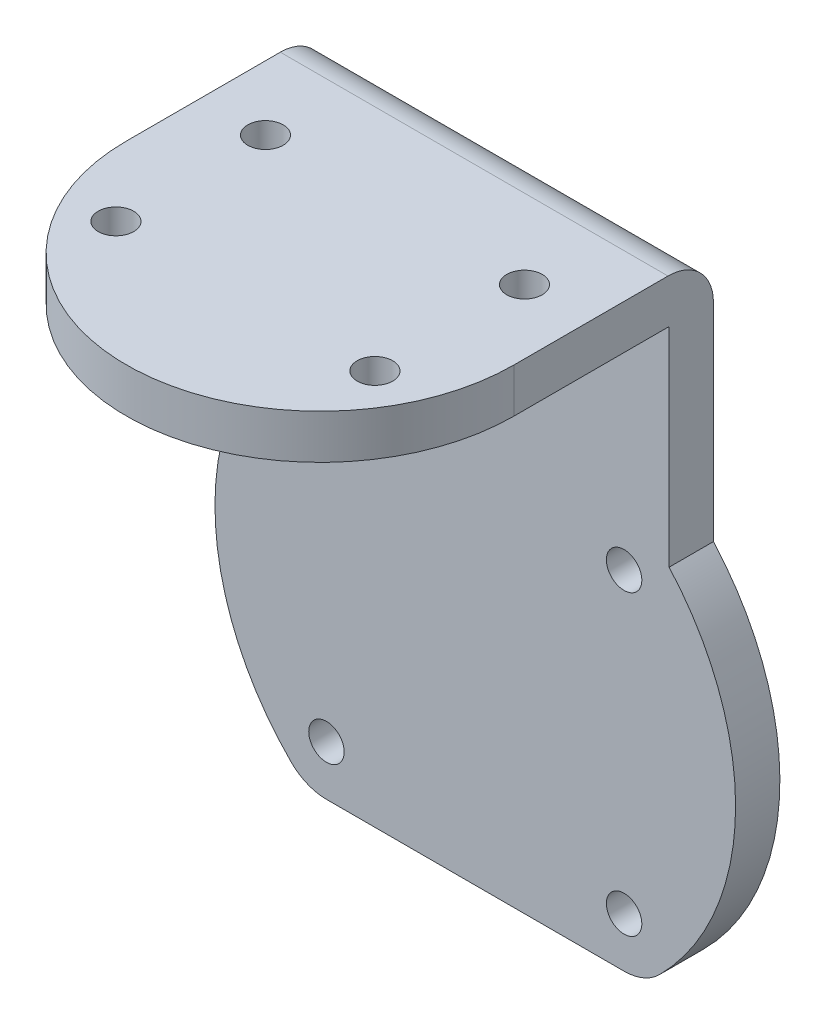
ISO-10303-21;
HEADER;
FILE_DESCRIPTION(('STEP AP214'),'2;1');
FILE_NAME('part.step','',(''),(''),'','','');
FILE_SCHEMA(('AUTOMOTIVE_DESIGN { 1 0 10303 214 1 1 1 1 }'));
ENDSEC;
DATA;
#1=APPLICATION_CONTEXT('core data for automotive mechanical design processes');
#2=APPLICATION_PROTOCOL_DEFINITION('international standard','automotive_design',2000,#1);
#3=PRODUCT_CONTEXT('',#1,'mechanical');
#4=PRODUCT('Part','Part','',(#3));
#5=PRODUCT_RELATED_PRODUCT_CATEGORY('part','',(#4));
#6=PRODUCT_DEFINITION_FORMATION('','',#4);
#7=PRODUCT_DEFINITION_CONTEXT('part definition',#1,'design');
#8=PRODUCT_DEFINITION('design','',#6,#7);
#9=PRODUCT_DEFINITION_SHAPE('','',#8);
#10=(LENGTH_UNIT() NAMED_UNIT(*) SI_UNIT(.MILLI.,.METRE.));
#11=(NAMED_UNIT(*) PLANE_ANGLE_UNIT() SI_UNIT($,.RADIAN.));
#12=(NAMED_UNIT(*) SI_UNIT($,.STERADIAN.) SOLID_ANGLE_UNIT());
#13=UNCERTAINTY_MEASURE_WITH_UNIT(LENGTH_MEASURE(1.E-05),#10,'distance_accuracy_value','');
#14=(GEOMETRIC_REPRESENTATION_CONTEXT(3) GLOBAL_UNCERTAINTY_ASSIGNED_CONTEXT((#13)) GLOBAL_UNIT_ASSIGNED_CONTEXT((#10,
#11,#12)) REPRESENTATION_CONTEXT('',''));
#15=CARTESIAN_POINT('',(0.,0.,0.));
#16=DIRECTION('',(0.,0.,1.));
#17=DIRECTION('',(1.,0.,0.));
#18=AXIS2_PLACEMENT_3D('',#15,#16,#17);
#19=CARTESIAN_POINT('',(0.,38.4999999999963,-21.5000000000017));
#20=DIRECTION('',(0.,1.,3.28625990152976E-13));
#21=DIRECTION('',(0.,3.28625990152976E-13,-1.));
#22=AXIS2_PLACEMENT_3D('',#19,#20,#21);
#23=PLANE('',#22);
#24=CARTESIAN_POINT('',(11.6913429510899,38.4999999999963,-0.749999999999176));
#25=DIRECTION('',(0.,-1.,0.));
#26=DIRECTION('',(0.,0.,1.));
#27=AXIS2_PLACEMENT_3D('',#24,#25,#26);
#28=CIRCLE('',#27,1.6);
#29=CARTESIAN_POINT('',(11.6913429510899,38.4999999999963,0.850000000000824));
#30=VERTEX_POINT('',#29);
#31=EDGE_CURVE('E179',#30,#30,#28,.T.);
#32=ORIENTED_EDGE('',*,*,#31,.T.);
#33=EDGE_LOOP('',(#32));
#34=FACE_BOUND('',#33,.T.);
#35=CARTESIAN_POINT('',(-11.6913429510899,38.4999999999963,-14.2499999999992));
#36=DIRECTION('',(0.,-1.,0.));
#37=DIRECTION('',(0.,0.,1.));
#38=AXIS2_PLACEMENT_3D('',#35,#36,#37);
#39=CIRCLE('',#38,1.6);
#40=CARTESIAN_POINT('',(-11.6913429510899,38.4999999999963,-12.6499999999992));
#41=VERTEX_POINT('',#40);
#42=EDGE_CURVE('E274',#41,#41,#39,.T.);
#43=ORIENTED_EDGE('',*,*,#42,.T.);
#44=EDGE_LOOP('',(#43));
#45=FACE_BOUND('',#44,.T.);
#46=CARTESIAN_POINT('',(-11.6913429510899,38.4999999999963,-0.749999999999184));
#47=DIRECTION('',(0.,-1.,0.));
#48=DIRECTION('',(0.,0.,1.));
#49=AXIS2_PLACEMENT_3D('',#46,#47,#48);
#50=CIRCLE('',#49,1.6);
#51=CARTESIAN_POINT('',(-11.6913429510899,38.4999999999963,0.850000000000816));
#52=VERTEX_POINT('',#51);
#53=EDGE_CURVE('E200',#52,#52,#50,.T.);
#54=ORIENTED_EDGE('',*,*,#53,.T.);
#55=EDGE_LOOP('',(#54));
#56=FACE_BOUND('',#55,.T.);
#57=CARTESIAN_POINT('',(11.6913429510899,38.4999999999963,-14.2499999999992));
#58=DIRECTION('',(0.,-1.,0.));
#59=DIRECTION('',(0.,0.,1.));
#60=AXIS2_PLACEMENT_3D('',#57,#58,#59);
#61=CIRCLE('',#60,1.6);
#62=CARTESIAN_POINT('',(11.6913429510899,38.4999999999963,-12.6499999999992));
#63=VERTEX_POINT('',#62);
#64=EDGE_CURVE('E201',#63,#63,#61,.T.);
#65=ORIENTED_EDGE('',*,*,#64,.T.);
#66=EDGE_LOOP('',(#65));
#67=FACE_BOUND('',#66,.T.);
#68=DIRECTION('',(0.,3.28625990152976E-13,-1.));
#69=VECTOR('',#68,1.);
#70=CARTESIAN_POINT('',(17.5,38.499999999994,-14.5000000000005));
#71=LINE('',#70,#69);
#72=CARTESIAN_POINT('',(17.5,38.4999999999893,-7.49999999999918));
#73=VERTEX_POINT('',#72);
#74=CARTESIAN_POINT('',(17.5,38.4999999999893,-21.400000000003));
#75=VERTEX_POINT('',#74);
#76=EDGE_CURVE('E229',#73,#75,#71,.T.);
#77=ORIENTED_EDGE('',*,*,#76,.T.);
#78=DIRECTION('',(1.,0.,0.));
#79=VECTOR('',#78,1.);
#80=CARTESIAN_POINT('',(0.,38.4999999999963,-21.4000000000017));
#81=LINE('',#80,#79);
#82=CARTESIAN_POINT('',(-17.5,38.4999999999893,-21.400000000003));
#83=VERTEX_POINT('',#82);
#84=EDGE_CURVE('E27',#83,#75,#81,.T.);
#85=ORIENTED_EDGE('',*,*,#84,.F.);
#86=DIRECTION('',(0.,-3.28625990152976E-13,1.));
#87=VECTOR('',#86,1.);
#88=CARTESIAN_POINT('',(-17.5,38.499999999997,-23.5000000000022));
#89=LINE('',#88,#87);
#90=CARTESIAN_POINT('',(-17.5,38.4999999999893,-7.49999999999918));
#91=VERTEX_POINT('',#90);
#92=EDGE_CURVE('E21',#83,#91,#89,.T.);
#93=ORIENTED_EDGE('',*,*,#92,.T.);
#94=CARTESIAN_POINT('',(0.,38.4999999999963,-7.49999999999918));
#95=DIRECTION('',(0.,1.,3.28625990152976E-13));
#96=DIRECTION('',(-1.,0.,0.));
#97=AXIS2_PLACEMENT_3D('',#94,#95,#96);
#98=CIRCLE('',#97,17.5);
#99=EDGE_CURVE('E249',#91,#73,#98,.T.);
#100=ORIENTED_EDGE('',*,*,#99,.T.);
#101=EDGE_LOOP('',(#77,#85,#93,#100));
#102=FACE_BOUND('',#101,.T.);
#103=ADVANCED_FACE('F17',(#34,#45,#56,#67,#102),#23,.T.);
#104=CARTESIAN_POINT('',(0.,34.3999999999963,-21.400000000003));
#105=DIRECTION('',(1.,0.,0.));
#106=DIRECTION('',(0.,0.707106781186673,-0.707106781186422));
#107=AXIS2_PLACEMENT_3D('',#104,#105,#106);
#108=CYLINDRICAL_SURFACE('',#107,0.1);
#109=CARTESIAN_POINT('',(17.5,34.3999999999963,-21.400000000003));
#110=DIRECTION('',(1.,0.,0.));
#111=DIRECTION('',(0.,0.707106781186673,-0.707106781186422));
#112=AXIS2_PLACEMENT_3D('',#109,#110,#111);
#113=CIRCLE('',#112,0.1);
#114=CARTESIAN_POINT('',(17.5,34.3999999999963,-21.500000000003));
#115=VERTEX_POINT('',#114);
#116=CARTESIAN_POINT('',(17.5,34.4999999999963,-21.400000000003));
#117=VERTEX_POINT('',#116);
#118=EDGE_CURVE('E296',#115,#117,#113,.T.);
#119=ORIENTED_EDGE('',*,*,#118,.T.);
#120=DIRECTION('',(1.,0.,0.));
#121=VECTOR('',#120,1.);
#122=CARTESIAN_POINT('',(0.,34.4999999999963,-21.400000000003));
#123=LINE('',#122,#121);
#124=CARTESIAN_POINT('',(-17.5,34.4999999999963,-21.400000000003));
#125=VERTEX_POINT('',#124);
#126=EDGE_CURVE('E11',#125,#117,#123,.T.);
#127=ORIENTED_EDGE('',*,*,#126,.F.);
#128=CARTESIAN_POINT('',(-17.5,34.3999999999963,-21.400000000003));
#129=DIRECTION('',(-1.,0.,0.));
#130=DIRECTION('',(0.,0.707106781186673,-0.707106781186422));
#131=AXIS2_PLACEMENT_3D('',#128,#129,#130);
#132=CIRCLE('',#131,0.1);
#133=CARTESIAN_POINT('',(-17.5,34.3999999999963,-21.500000000003));
#134=VERTEX_POINT('',#133);
#135=EDGE_CURVE('E327',#125,#134,#132,.T.);
#136=ORIENTED_EDGE('',*,*,#135,.T.);
#137=DIRECTION('',(-1.,0.,0.));
#138=VECTOR('',#137,1.);
#139=CARTESIAN_POINT('',(0.,34.3999999999963,-21.500000000003));
#140=LINE('',#139,#138);
#141=EDGE_CURVE('E184',#115,#134,#140,.T.);
#142=ORIENTED_EDGE('',*,*,#141,.F.);
#143=EDGE_LOOP('',(#119,#127,#136,#142));
#144=FACE_BOUND('',#143,.T.);
#145=ADVANCED_FACE('F19',(#144),#108,.F.);
#146=CARTESIAN_POINT('',(0.,34.4999999999963,-21.5000000000031));
#147=DIRECTION('',(0.,1.,3.28625990152976E-13));
#148=DIRECTION('',(0.,3.28625990152976E-13,-1.));
#149=AXIS2_PLACEMENT_3D('',#146,#147,#148);
#150=PLANE('',#149);
#151=CARTESIAN_POINT('',(11.6913429510899,34.4999999999963,-0.749999999999177));
#152=DIRECTION('',(0.,1.,0.));
#153=DIRECTION('',(0.,0.,1.));
#154=AXIS2_PLACEMENT_3D('',#151,#152,#153);
#155=CIRCLE('',#154,1.6);
#156=CARTESIAN_POINT('',(11.6913429510899,34.4999999999963,0.850000000000823));
#157=VERTEX_POINT('',#156);
#158=EDGE_CURVE('E174',#157,#157,#155,.T.);
#159=ORIENTED_EDGE('',*,*,#158,.T.);
#160=EDGE_LOOP('',(#159));
#161=FACE_BOUND('',#160,.T.);
#162=CARTESIAN_POINT('',(-11.6913429510899,34.4999999999963,-14.2499999999992));
#163=DIRECTION('',(0.,1.,0.));
#164=DIRECTION('',(0.,0.,1.));
#165=AXIS2_PLACEMENT_3D('',#162,#163,#164);
#166=CIRCLE('',#165,1.6);
#167=CARTESIAN_POINT('',(-11.6913429510899,34.4999999999963,-12.6499999999992));
#168=VERTEX_POINT('',#167);
#169=EDGE_CURVE('E306',#168,#168,#166,.T.);
#170=ORIENTED_EDGE('',*,*,#169,.T.);
#171=EDGE_LOOP('',(#170));
#172=FACE_BOUND('',#171,.T.);
#173=CARTESIAN_POINT('',(-11.6913429510899,34.4999999999963,-0.749999999999185));
#174=DIRECTION('',(0.,1.,0.));
#175=DIRECTION('',(0.,0.,1.));
#176=AXIS2_PLACEMENT_3D('',#173,#174,#175);
#177=CIRCLE('',#176,1.6);
#178=CARTESIAN_POINT('',(-11.6913429510899,34.4999999999963,0.850000000000815));
#179=VERTEX_POINT('',#178);
#180=EDGE_CURVE('E270',#179,#179,#177,.T.);
#181=ORIENTED_EDGE('',*,*,#180,.T.);
#182=EDGE_LOOP('',(#181));
#183=FACE_BOUND('',#182,.T.);
#184=CARTESIAN_POINT('',(11.6913429510899,34.4999999999963,-14.2499999999992));
#185=DIRECTION('',(0.,1.,0.));
#186=DIRECTION('',(0.,0.,1.));
#187=AXIS2_PLACEMENT_3D('',#184,#185,#186);
#188=CIRCLE('',#187,1.6);
#189=CARTESIAN_POINT('',(11.6913429510899,34.4999999999963,-12.6499999999992));
#190=VERTEX_POINT('',#189);
#191=EDGE_CURVE('E196',#190,#190,#188,.T.);
#192=ORIENTED_EDGE('',*,*,#191,.T.);
#193=EDGE_LOOP('',(#192));
#194=FACE_BOUND('',#193,.T.);
#195=DIRECTION('',(0.,-3.28625990152976E-13,1.));
#196=VECTOR('',#195,1.);
#197=CARTESIAN_POINT('',(17.5,34.499999999994,-14.5000000000018));
#198=LINE('',#197,#196);
#199=CARTESIAN_POINT('',(17.5,34.4999999999917,-7.49999999999918));
#200=VERTEX_POINT('',#199);
#201=EDGE_CURVE('E228',#117,#200,#198,.T.);
#202=ORIENTED_EDGE('',*,*,#201,.T.);
#203=CARTESIAN_POINT('',(0.,34.4999999999963,-7.49999999999918));
#204=DIRECTION('',(0.,-1.,-3.28625990152976E-13));
#205=DIRECTION('',(-1.,0.,0.));
#206=AXIS2_PLACEMENT_3D('',#203,#204,#205);
#207=CIRCLE('',#206,17.5);
#208=CARTESIAN_POINT('',(-17.5,34.4999999999917,-7.49999999999918));
#209=VERTEX_POINT('',#208);
#210=EDGE_CURVE('E253',#200,#209,#207,.T.);
#211=ORIENTED_EDGE('',*,*,#210,.T.);
#212=DIRECTION('',(0.,3.28625990152976E-13,-1.));
#213=VECTOR('',#212,1.);
#214=CARTESIAN_POINT('',(-17.5,34.499999999997,-23.5000000000035));
#215=LINE('',#214,#213);
#216=EDGE_CURVE('E329',#209,#125,#215,.T.);
#217=ORIENTED_EDGE('',*,*,#216,.T.);
#218=ORIENTED_EDGE('',*,*,#126,.T.);
#219=EDGE_LOOP('',(#202,#211,#217,#218));
#220=FACE_BOUND('',#219,.T.);
#221=ADVANCED_FACE('F364',(#161,#172,#183,#194,#220),#150,.F.);
#222=CARTESIAN_POINT('',(0.,34.3999999999963,-21.400000000003));
#223=DIRECTION('',(1.,0.,0.));
#224=DIRECTION('',(0.,0.707106781186673,-0.707106781186422));
#225=AXIS2_PLACEMENT_3D('',#222,#223,#224);
#226=CYLINDRICAL_SURFACE('',#225,4.1);
#227=CARTESIAN_POINT('',(17.5,34.3999999999963,-21.400000000003));
#228=DIRECTION('',(-1.,0.,0.));
#229=DIRECTION('',(0.,0.707106781186673,-0.707106781186422));
#230=AXIS2_PLACEMENT_3D('',#227,#228,#229);
#231=CIRCLE('',#230,4.1);
#232=CARTESIAN_POINT('',(17.5,34.3999999999963,-25.5000000000027));
#233=VERTEX_POINT('',#232);
#234=EDGE_CURVE('E178',#75,#233,#231,.T.);
#235=ORIENTED_EDGE('',*,*,#234,.T.);
#236=DIRECTION('',(-1.,0.,0.));
#237=VECTOR('',#236,1.);
#238=CARTESIAN_POINT('',(0.,34.3999999999963,-25.500000000003));
#239=LINE('',#238,#237);
#240=CARTESIAN_POINT('',(-17.5,34.3999999999963,-25.5000000000027));
#241=VERTEX_POINT('',#240);
#242=EDGE_CURVE('E286',#233,#241,#239,.T.);
#243=ORIENTED_EDGE('',*,*,#242,.T.);
#244=CARTESIAN_POINT('',(-17.5,34.3999999999963,-21.400000000003));
#245=DIRECTION('',(1.,0.,0.));
#246=DIRECTION('',(0.,0.707106781186673,-0.707106781186422));
#247=AXIS2_PLACEMENT_3D('',#244,#245,#246);
#248=CIRCLE('',#247,4.1);
#249=EDGE_CURVE('E323',#241,#83,#248,.T.);
#250=ORIENTED_EDGE('',*,*,#249,.T.);
#251=ORIENTED_EDGE('',*,*,#84,.T.);
#252=EDGE_LOOP('',(#235,#243,#250,#251));
#253=FACE_BOUND('',#252,.T.);
#254=ADVANCED_FACE('F354',(#253),#226,.T.);
#255=CARTESIAN_POINT('',(-17.5,38.4999999999893,-25.5000000000027));
#256=DIRECTION('',(1.,0.,0.));
#257=DIRECTION('',(0.,0.,-1.));
#258=AXIS2_PLACEMENT_3D('',#255,#256,#257);
#259=PLANE('',#258);
#260=ORIENTED_EDGE('',*,*,#249,.F.);
#261=DIRECTION('',(0.,1.,0.));
#262=VECTOR('',#261,1.);
#263=CARTESIAN_POINT('',(-17.5,4.99999999999471,-25.500000000003));
#264=LINE('',#263,#262);
#265=CARTESIAN_POINT('',(-17.5,15.6843871413581,-25.500000000003));
#266=VERTEX_POINT('',#265);
#267=EDGE_CURVE('E282',#266,#241,#264,.T.);
#268=ORIENTED_EDGE('',*,*,#267,.F.);
#269=DIRECTION('',(0.,0.,1.));
#270=VECTOR('',#269,1.);
#271=CARTESIAN_POINT('',(-17.5,15.6843871413581,-25.500000000003));
#272=LINE('',#271,#270);
#273=CARTESIAN_POINT('',(-17.5,15.6843871413581,-21.500000000003));
#274=VERTEX_POINT('',#273);
#275=EDGE_CURVE('E256',#266,#274,#272,.T.);
#276=ORIENTED_EDGE('',*,*,#275,.T.);
#277=DIRECTION('',(0.,-1.,0.));
#278=VECTOR('',#277,1.);
#279=CARTESIAN_POINT('',(-17.5,4.99999999999471,-21.500000000003));
#280=LINE('',#279,#278);
#281=EDGE_CURVE('E205',#134,#274,#280,.T.);
#282=ORIENTED_EDGE('',*,*,#281,.F.);
#283=ORIENTED_EDGE('',*,*,#135,.F.);
#284=ORIENTED_EDGE('',*,*,#216,.F.);
#285=DIRECTION('',(0.,-1.,0.));
#286=VECTOR('',#285,1.);
#287=CARTESIAN_POINT('',(-17.5,38.4999999999893,-7.49999999999918));
#288=LINE('',#287,#286);
#289=EDGE_CURVE('E252',#91,#209,#288,.T.);
#290=ORIENTED_EDGE('',*,*,#289,.F.);
#291=ORIENTED_EDGE('',*,*,#92,.F.);
#292=EDGE_LOOP('',(#260,#268,#276,#282,#283,#284,#290,#291));
#293=FACE_BOUND('',#292,.T.);
#294=ADVANCED_FACE('F342',(#293),#259,.F.);
#295=CARTESIAN_POINT('',(0.,38.4999999999893,-7.49999999999918));
#296=DIRECTION('',(0.,-1.,0.));
#297=DIRECTION('',(-1.,0.,0.));
#298=AXIS2_PLACEMENT_3D('',#295,#296,#297);
#299=CYLINDRICAL_SURFACE('',#298,17.5);
#300=ORIENTED_EDGE('',*,*,#210,.F.);
#301=DIRECTION('',(0.,-1.,0.));
#302=VECTOR('',#301,1.);
#303=CARTESIAN_POINT('',(17.5,38.4999999999893,-7.49999999999918));
#304=LINE('',#303,#302);
#305=EDGE_CURVE('E224',#73,#200,#304,.T.);
#306=ORIENTED_EDGE('',*,*,#305,.F.);
#307=ORIENTED_EDGE('',*,*,#99,.F.);
#308=ORIENTED_EDGE('',*,*,#289,.T.);
#309=EDGE_LOOP('',(#300,#306,#307,#308));
#310=FACE_BOUND('',#309,.T.);
#311=ADVANCED_FACE('F344',(#310),#299,.T.);
#312=CARTESIAN_POINT('',(17.5,38.4999999999893,-7.49999999999918));
#313=DIRECTION('',(-1.,0.,0.));
#314=DIRECTION('',(0.,0.,1.));
#315=AXIS2_PLACEMENT_3D('',#312,#313,#314);
#316=PLANE('',#315);
#317=ORIENTED_EDGE('',*,*,#234,.F.);
#318=ORIENTED_EDGE('',*,*,#76,.F.);
#319=ORIENTED_EDGE('',*,*,#305,.T.);
#320=ORIENTED_EDGE('',*,*,#201,.F.);
#321=ORIENTED_EDGE('',*,*,#118,.F.);
#322=DIRECTION('',(0.,1.,0.));
#323=VECTOR('',#322,1.);
#324=CARTESIAN_POINT('',(17.5,4.99999999999471,-21.500000000003));
#325=LINE('',#324,#323);
#326=CARTESIAN_POINT('',(17.5,15.6843871413581,-21.500000000003));
#327=VERTEX_POINT('',#326);
#328=EDGE_CURVE('E180',#327,#115,#325,.T.);
#329=ORIENTED_EDGE('',*,*,#328,.F.);
#330=DIRECTION('',(0.,0.,1.));
#331=VECTOR('',#330,1.);
#332=CARTESIAN_POINT('',(17.5,15.6843871413581,-25.500000000003));
#333=LINE('',#332,#331);
#334=CARTESIAN_POINT('',(17.5,15.6843871413581,-25.500000000003));
#335=VERTEX_POINT('',#334);
#336=EDGE_CURVE('E248',#335,#327,#333,.T.);
#337=ORIENTED_EDGE('',*,*,#336,.F.);
#338=DIRECTION('',(0.,-1.,0.));
#339=VECTOR('',#338,1.);
#340=CARTESIAN_POINT('',(17.5,4.99999999999472,-25.5000000000031));
#341=LINE('',#340,#339);
#342=EDGE_CURVE('E290',#233,#335,#341,.T.);
#343=ORIENTED_EDGE('',*,*,#342,.F.);
#344=EDGE_LOOP('',(#317,#318,#319,#320,#321,#329,#337,#343));
#345=FACE_BOUND('',#344,.T.);
#346=ADVANCED_FACE('F349',(#345),#316,.F.);
#347=CARTESIAN_POINT('',(11.6913429510899,-1.0742517986273E-11,-0.749999999999184));
#348=DIRECTION('',(0.,-1.,0.));
#349=DIRECTION('',(0.,0.,1.));
#350=AXIS2_PLACEMENT_3D('',#347,#348,#349);
#351=CYLINDRICAL_SURFACE('',#350,1.6);
#352=ORIENTED_EDGE('',*,*,#158,.F.);
#353=EDGE_LOOP('',(#352));
#354=FACE_BOUND('',#353,.T.);
#355=ORIENTED_EDGE('',*,*,#31,.F.);
#356=EDGE_LOOP('',(#355));
#357=FACE_BOUND('',#356,.T.);
#358=ADVANCED_FACE('F398',(#354,#357),#351,.F.);
#359=CARTESIAN_POINT('',(-11.6913429510899,-1.07380770941745E-11,-14.2499999999992));
#360=DIRECTION('',(0.,-1.,0.));
#361=DIRECTION('',(0.,0.,1.));
#362=AXIS2_PLACEMENT_3D('',#359,#360,#361);
#363=CYLINDRICAL_SURFACE('',#362,1.6);
#364=ORIENTED_EDGE('',*,*,#169,.F.);
#365=EDGE_LOOP('',(#364));
#366=FACE_BOUND('',#365,.T.);
#367=ORIENTED_EDGE('',*,*,#42,.F.);
#368=EDGE_LOOP('',(#367));
#369=FACE_BOUND('',#368,.T.);
#370=ADVANCED_FACE('F415',(#366,#369),#363,.F.);
#371=CARTESIAN_POINT('',(-11.6913429510899,-1.0742517986273E-11,-0.749999999999192));
#372=DIRECTION('',(0.,-1.,0.));
#373=DIRECTION('',(0.,0.,1.));
#374=AXIS2_PLACEMENT_3D('',#371,#372,#373);
#375=CYLINDRICAL_SURFACE('',#374,1.6);
#376=ORIENTED_EDGE('',*,*,#180,.F.);
#377=EDGE_LOOP('',(#376));
#378=FACE_BOUND('',#377,.T.);
#379=ORIENTED_EDGE('',*,*,#53,.F.);
#380=EDGE_LOOP('',(#379));
#381=FACE_BOUND('',#380,.T.);
#382=ADVANCED_FACE('F412',(#378,#381),#375,.F.);
#383=CARTESIAN_POINT('',(11.6913429510899,-1.07380770941745E-11,-14.2499999999992));
#384=DIRECTION('',(0.,-1.,0.));
#385=DIRECTION('',(0.,0.,1.));
#386=AXIS2_PLACEMENT_3D('',#383,#384,#385);
#387=CYLINDRICAL_SURFACE('',#386,1.6);
#388=ORIENTED_EDGE('',*,*,#191,.F.);
#389=EDGE_LOOP('',(#388));
#390=FACE_BOUND('',#389,.T.);
#391=ORIENTED_EDGE('',*,*,#64,.F.);
#392=EDGE_LOOP('',(#391));
#393=FACE_BOUND('',#392,.T.);
#394=ADVANCED_FACE('F410',(#390,#393),#387,.F.);
#395=CARTESIAN_POINT('',(0.,-28.5,-25.5000000000031));
#396=DIRECTION('',(0.,0.,-1.));
#397=DIRECTION('',(-1.,0.,0.));
#398=AXIS2_PLACEMENT_3D('',#395,#396,#397);
#399=PLANE('',#398);
#400=CARTESIAN_POINT('',(13.4350288425444,-13.4350288425444,-25.5000000000031));
#401=DIRECTION('',(0.,0.,1.));
#402=DIRECTION('',(-1.,0.,0.));
#403=AXIS2_PLACEMENT_3D('',#400,#401,#402);
#404=CIRCLE('',#403,1.6);
#405=CARTESIAN_POINT('',(11.8350288425444,-13.4350288425444,-25.5000000000031));
#406=VERTEX_POINT('',#405);
#407=EDGE_CURVE('E220',#406,#406,#404,.T.);
#408=ORIENTED_EDGE('',*,*,#407,.T.);
#409=EDGE_LOOP('',(#408));
#410=FACE_BOUND('',#409,.T.);
#411=CARTESIAN_POINT('',(-13.4350288425444,13.4350288425444,-25.5000000000031));
#412=DIRECTION('',(0.,0.,1.));
#413=DIRECTION('',(-1.,0.,0.));
#414=AXIS2_PLACEMENT_3D('',#411,#412,#413);
#415=CIRCLE('',#414,1.6);
#416=CARTESIAN_POINT('',(-15.0350288425444,13.4350288425444,-25.5000000000031));
#417=VERTEX_POINT('',#416);
#418=EDGE_CURVE('E216',#417,#417,#415,.T.);
#419=ORIENTED_EDGE('',*,*,#418,.T.);
#420=EDGE_LOOP('',(#419));
#421=FACE_BOUND('',#420,.T.);
#422=CARTESIAN_POINT('',(13.4350288425444,13.4350288425444,-25.5000000000031));
#423=DIRECTION('',(0.,0.,1.));
#424=DIRECTION('',(-1.,0.,0.));
#425=AXIS2_PLACEMENT_3D('',#422,#423,#424);
#426=CIRCLE('',#425,1.6);
#427=CARTESIAN_POINT('',(11.8350288425444,13.4350288425444,-25.5000000000031));
#428=VERTEX_POINT('',#427);
#429=EDGE_CURVE('E221',#428,#428,#426,.T.);
#430=ORIENTED_EDGE('',*,*,#429,.T.);
#431=EDGE_LOOP('',(#430));
#432=FACE_BOUND('',#431,.T.);
#433=CARTESIAN_POINT('',(-13.4350288425444,-13.4350288425444,-25.5000000000031));
#434=DIRECTION('',(0.,0.,1.));
#435=DIRECTION('',(-1.,0.,0.));
#436=AXIS2_PLACEMENT_3D('',#433,#434,#435);
#437=CIRCLE('',#436,1.6);
#438=CARTESIAN_POINT('',(-15.0350288425444,-13.4350288425444,-25.5000000000031));
#439=VERTEX_POINT('',#438);
#440=EDGE_CURVE('E263',#439,#439,#437,.T.);
#441=ORIENTED_EDGE('',*,*,#440,.T.);
#442=EDGE_LOOP('',(#441));
#443=FACE_BOUND('',#442,.T.);
#444=CARTESIAN_POINT('',(-13.4350288425444,-13.4350288425444,-25.5000000000031));
#445=DIRECTION('',(0.,0.,-1.));
#446=DIRECTION('',(-1.,0.,0.));
#447=AXIS2_PLACEMENT_3D('',#444,#445,#446);
#448=CIRCLE('',#447,4.5);
#449=CARTESIAN_POINT('',(-13.4350288425444,-17.9350288425444,-25.5000000000031));
#450=VERTEX_POINT('',#449);
#451=CARTESIAN_POINT('',(-16.6170093578839,-16.6170093578839,-25.5000000000031));
#452=VERTEX_POINT('',#451);
#453=EDGE_CURVE('E156',#450,#452,#448,.T.);
#454=ORIENTED_EDGE('',*,*,#453,.T.);
#455=CARTESIAN_POINT('',(0.,0.,-25.5000000000031));
#456=DIRECTION('',(0.,0.,-1.));
#457=DIRECTION('',(-1.,0.,0.));
#458=AXIS2_PLACEMENT_3D('',#455,#456,#457);
#459=CIRCLE('',#458,23.5);
#460=EDGE_CURVE('E259',#452,#266,#459,.T.);
#461=ORIENTED_EDGE('',*,*,#460,.T.);
#462=ORIENTED_EDGE('',*,*,#267,.T.);
#463=ORIENTED_EDGE('',*,*,#242,.F.);
#464=ORIENTED_EDGE('',*,*,#342,.T.);
#465=CARTESIAN_POINT('',(0.,0.,-25.5000000000031));
#466=DIRECTION('',(0.,0.,-1.));
#467=DIRECTION('',(-1.,0.,0.));
#468=AXIS2_PLACEMENT_3D('',#465,#466,#467);
#469=CIRCLE('',#468,23.5);
#470=CARTESIAN_POINT('',(16.6170093578839,-16.6170093578839,-25.5000000000031));
#471=VERTEX_POINT('',#470);
#472=EDGE_CURVE('E245',#335,#471,#469,.T.);
#473=ORIENTED_EDGE('',*,*,#472,.T.);
#474=CARTESIAN_POINT('',(13.4350288425444,-13.4350288425444,-25.5000000000031));
#475=DIRECTION('',(0.,0.,-1.));
#476=DIRECTION('',(-1.,0.,0.));
#477=AXIS2_PLACEMENT_3D('',#474,#475,#476);
#478=CIRCLE('',#477,4.5);
#479=CARTESIAN_POINT('',(13.4350288425444,-17.9350288425444,-25.5000000000031));
#480=VERTEX_POINT('',#479);
#481=EDGE_CURVE('E195',#471,#480,#478,.T.);
#482=ORIENTED_EDGE('',*,*,#481,.T.);
#483=DIRECTION('',(-1.,0.,0.));
#484=VECTOR('',#483,1.);
#485=CARTESIAN_POINT('',(6.7175144212722,-17.9350288425444,-25.5000000000031));
#486=LINE('',#485,#484);
#487=EDGE_CURVE('E161',#480,#450,#486,.T.);
#488=ORIENTED_EDGE('',*,*,#487,.T.);
#489=EDGE_LOOP('',(#454,#461,#462,#463,#464,#473,#482,#488));
#490=FACE_BOUND('',#489,.T.);
#491=ADVANCED_FACE('F358',(#410,#421,#432,#443,#490),#399,.T.);
#492=CARTESIAN_POINT('',(13.4350288425444,-13.4350288425444,12.9999999999969));
#493=DIRECTION('',(0.,0.,1.));
#494=DIRECTION('',(-1.,0.,0.));
#495=AXIS2_PLACEMENT_3D('',#492,#493,#494);
#496=CYLINDRICAL_SURFACE('',#495,1.6);
#497=CARTESIAN_POINT('',(13.4350288425444,-13.4350288425444,-21.5000000000031));
#498=DIRECTION('',(0.,0.,-1.));
#499=DIRECTION('',(-1.,0.,0.));
#500=AXIS2_PLACEMENT_3D('',#497,#498,#499);
#501=CIRCLE('',#500,1.6);
#502=CARTESIAN_POINT('',(11.8350288425444,-13.4350288425444,-21.5000000000031));
#503=VERTEX_POINT('',#502);
#504=EDGE_CURVE('E211',#503,#503,#501,.T.);
#505=ORIENTED_EDGE('',*,*,#504,.F.);
#506=EDGE_LOOP('',(#505));
#507=FACE_BOUND('',#506,.T.);
#508=ORIENTED_EDGE('',*,*,#407,.F.);
#509=EDGE_LOOP('',(#508));
#510=FACE_BOUND('',#509,.T.);
#511=ADVANCED_FACE('F403',(#507,#510),#496,.F.);
#512=CARTESIAN_POINT('',(-13.4350288425444,13.4350288425444,12.9999999999969));
#513=DIRECTION('',(0.,0.,1.));
#514=DIRECTION('',(-1.,0.,0.));
#515=AXIS2_PLACEMENT_3D('',#512,#513,#514);
#516=CYLINDRICAL_SURFACE('',#515,1.6);
#517=CARTESIAN_POINT('',(-13.4350288425444,13.4350288425444,-21.5000000000031));
#518=DIRECTION('',(0.,0.,-1.));
#519=DIRECTION('',(-1.,0.,0.));
#520=AXIS2_PLACEMENT_3D('',#517,#518,#519);
#521=CIRCLE('',#520,1.6);
#522=CARTESIAN_POINT('',(-15.0350288425444,13.4350288425444,-21.5000000000031));
#523=VERTEX_POINT('',#522);
#524=EDGE_CURVE('E233',#523,#523,#521,.T.);
#525=ORIENTED_EDGE('',*,*,#524,.F.);
#526=EDGE_LOOP('',(#525));
#527=FACE_BOUND('',#526,.T.);
#528=ORIENTED_EDGE('',*,*,#418,.F.);
#529=EDGE_LOOP('',(#528));
#530=FACE_BOUND('',#529,.T.);
#531=ADVANCED_FACE('F387',(#527,#530),#516,.F.);
#532=CARTESIAN_POINT('',(13.4350288425444,13.4350288425444,12.9999999999969));
#533=DIRECTION('',(0.,0.,1.));
#534=DIRECTION('',(-1.,0.,0.));
#535=AXIS2_PLACEMENT_3D('',#532,#533,#534);
#536=CYLINDRICAL_SURFACE('',#535,1.6);
#537=CARTESIAN_POINT('',(13.4350288425444,13.4350288425444,-21.5000000000031));
#538=DIRECTION('',(0.,0.,-1.));
#539=DIRECTION('',(-1.,0.,0.));
#540=AXIS2_PLACEMENT_3D('',#537,#538,#539);
#541=CIRCLE('',#540,1.6);
#542=CARTESIAN_POINT('',(11.8350288425444,13.4350288425444,-21.5000000000031));
#543=VERTEX_POINT('',#542);
#544=EDGE_CURVE('E237',#543,#543,#541,.T.);
#545=ORIENTED_EDGE('',*,*,#544,.F.);
#546=EDGE_LOOP('',(#545));
#547=FACE_BOUND('',#546,.T.);
#548=ORIENTED_EDGE('',*,*,#429,.F.);
#549=EDGE_LOOP('',(#548));
#550=FACE_BOUND('',#549,.T.);
#551=ADVANCED_FACE('F383',(#547,#550),#536,.F.);
#552=CARTESIAN_POINT('',(-13.4350288425444,-13.4350288425444,12.9999999999969));
#553=DIRECTION('',(0.,0.,1.));
#554=DIRECTION('',(-1.,0.,0.));
#555=AXIS2_PLACEMENT_3D('',#552,#553,#554);
#556=CYLINDRICAL_SURFACE('',#555,1.6);
#557=CARTESIAN_POINT('',(-13.4350288425444,-13.4350288425444,-21.5000000000031));
#558=DIRECTION('',(0.,0.,-1.));
#559=DIRECTION('',(-1.,0.,0.));
#560=AXIS2_PLACEMENT_3D('',#557,#558,#559);
#561=CIRCLE('',#560,1.6);
#562=CARTESIAN_POINT('',(-15.0350288425444,-13.4350288425444,-21.5000000000031));
#563=VERTEX_POINT('',#562);
#564=EDGE_CURVE('E241',#563,#563,#561,.T.);
#565=ORIENTED_EDGE('',*,*,#564,.F.);
#566=EDGE_LOOP('',(#565));
#567=FACE_BOUND('',#566,.T.);
#568=ORIENTED_EDGE('',*,*,#440,.F.);
#569=EDGE_LOOP('',(#568));
#570=FACE_BOUND('',#569,.T.);
#571=ADVANCED_FACE('F386',(#567,#570),#556,.F.);
#572=CARTESIAN_POINT('',(0.,0.,-25.5000000000031));
#573=DIRECTION('',(0.,0.,1.));
#574=DIRECTION('',(-1.,0.,0.));
#575=AXIS2_PLACEMENT_3D('',#572,#573,#574);
#576=CYLINDRICAL_SURFACE('',#575,23.5);
#577=DIRECTION('',(0.,0.,1.));
#578=VECTOR('',#577,1.);
#579=CARTESIAN_POINT('',(-16.6170093578839,-16.6170093578839,-25.5000000000031));
#580=LINE('',#579,#578);
#581=CARTESIAN_POINT('',(-16.6170093578839,-16.6170093578839,-21.5000000000031));
#582=VERTEX_POINT('',#581);
#583=EDGE_CURVE('E149',#452,#582,#580,.T.);
#584=ORIENTED_EDGE('',*,*,#583,.T.);
#585=CARTESIAN_POINT('',(0.,0.,-21.5000000000031));
#586=DIRECTION('',(0.,0.,1.));
#587=DIRECTION('',(-1.,0.,0.));
#588=AXIS2_PLACEMENT_3D('',#585,#586,#587);
#589=CIRCLE('',#588,23.5);
#590=EDGE_CURVE('E144',#274,#582,#589,.T.);
#591=ORIENTED_EDGE('',*,*,#590,.F.);
#592=ORIENTED_EDGE('',*,*,#275,.F.);
#593=ORIENTED_EDGE('',*,*,#460,.F.);
#594=EDGE_LOOP('',(#584,#591,#592,#593));
#595=FACE_BOUND('',#594,.T.);
#596=ADVANCED_FACE('F360',(#595),#576,.T.);
#597=CARTESIAN_POINT('',(0.,0.,-25.5000000000031));
#598=DIRECTION('',(0.,0.,1.));
#599=DIRECTION('',(0.999626581100163,-0.0273257819284285,0.));
#600=AXIS2_PLACEMENT_3D('',#597,#598,#599);
#601=CYLINDRICAL_SURFACE('',#600,23.5);
#602=DIRECTION('',(0.,0.,1.));
#603=VECTOR('',#602,1.);
#604=CARTESIAN_POINT('',(16.6170093578839,-16.6170093578839,-25.5000000000031));
#605=LINE('',#604,#603);
#606=CARTESIAN_POINT('',(16.6170093578839,-16.6170093578839,-21.5000000000031));
#607=VERTEX_POINT('',#606);
#608=EDGE_CURVE('E150',#471,#607,#605,.T.);
#609=ORIENTED_EDGE('',*,*,#608,.F.);
#610=ORIENTED_EDGE('',*,*,#472,.F.);
#611=ORIENTED_EDGE('',*,*,#336,.T.);
#612=CARTESIAN_POINT('',(0.,0.,-21.5000000000031));
#613=DIRECTION('',(0.,0.,1.));
#614=DIRECTION('',(-1.,0.,0.));
#615=AXIS2_PLACEMENT_3D('',#612,#613,#614);
#616=CIRCLE('',#615,23.5);
#617=EDGE_CURVE('E185',#607,#327,#616,.T.);
#618=ORIENTED_EDGE('',*,*,#617,.F.);
#619=EDGE_LOOP('',(#609,#610,#611,#618));
#620=FACE_BOUND('',#619,.T.);
#621=ADVANCED_FACE('F391',(#620),#601,.T.);
#622=CARTESIAN_POINT('',(0.,-28.5,-21.5000000000031));
#623=DIRECTION('',(0.,0.,-1.));
#624=DIRECTION('',(-1.,0.,0.));
#625=AXIS2_PLACEMENT_3D('',#622,#623,#624);
#626=PLANE('',#625);
#627=ORIENTED_EDGE('',*,*,#564,.T.);
#628=EDGE_LOOP('',(#627));
#629=FACE_BOUND('',#628,.T.);
#630=ORIENTED_EDGE('',*,*,#544,.T.);
#631=EDGE_LOOP('',(#630));
#632=FACE_BOUND('',#631,.T.);
#633=ORIENTED_EDGE('',*,*,#524,.T.);
#634=EDGE_LOOP('',(#633));
#635=FACE_BOUND('',#634,.T.);
#636=ORIENTED_EDGE('',*,*,#504,.T.);
#637=EDGE_LOOP('',(#636));
#638=FACE_BOUND('',#637,.T.);
#639=CARTESIAN_POINT('',(-13.4350288425444,-13.4350288425444,-21.5000000000031));
#640=DIRECTION('',(0.,0.,1.));
#641=DIRECTION('',(-1.,0.,0.));
#642=AXIS2_PLACEMENT_3D('',#639,#640,#641);
#643=CIRCLE('',#642,4.5);
#644=CARTESIAN_POINT('',(-13.4350288425444,-17.9350288425444,-21.5000000000031));
#645=VERTEX_POINT('',#644);
#646=EDGE_CURVE('E136',#582,#645,#643,.T.);
#647=ORIENTED_EDGE('',*,*,#646,.T.);
#648=DIRECTION('',(1.,0.,0.));
#649=VECTOR('',#648,1.);
#650=CARTESIAN_POINT('',(6.7175144212722,-17.9350288425444,-21.5000000000031));
#651=LINE('',#650,#649);
#652=CARTESIAN_POINT('',(13.4350288425444,-17.9350288425444,-21.5000000000031));
#653=VERTEX_POINT('',#652);
#654=EDGE_CURVE('E141',#645,#653,#651,.T.);
#655=ORIENTED_EDGE('',*,*,#654,.T.);
#656=CARTESIAN_POINT('',(13.4350288425444,-13.4350288425444,-21.5000000000031));
#657=DIRECTION('',(0.,0.,1.));
#658=DIRECTION('',(-1.,0.,0.));
#659=AXIS2_PLACEMENT_3D('',#656,#657,#658);
#660=CIRCLE('',#659,4.5);
#661=EDGE_CURVE('E187',#653,#607,#660,.T.);
#662=ORIENTED_EDGE('',*,*,#661,.T.);
#663=ORIENTED_EDGE('',*,*,#617,.T.);
#664=ORIENTED_EDGE('',*,*,#328,.T.);
#665=ORIENTED_EDGE('',*,*,#141,.T.);
#666=ORIENTED_EDGE('',*,*,#281,.T.);
#667=ORIENTED_EDGE('',*,*,#590,.T.);
#668=EDGE_LOOP('',(#647,#655,#662,#663,#664,#665,#666,#667));
#669=FACE_BOUND('',#668,.T.);
#670=ADVANCED_FACE('F138',(#629,#632,#635,#638,#669),#626,.F.);
#671=CARTESIAN_POINT('',(-13.4350288425444,-13.4350288425444,-25.5000000000031));
#672=DIRECTION('',(0.,0.,1.));
#673=DIRECTION('',(-1.,0.,0.));
#674=AXIS2_PLACEMENT_3D('',#671,#672,#673);
#675=CYLINDRICAL_SURFACE('',#674,4.5);
#676=ORIENTED_EDGE('',*,*,#646,.F.);
#677=ORIENTED_EDGE('',*,*,#583,.F.);
#678=ORIENTED_EDGE('',*,*,#453,.F.);
#679=DIRECTION('',(0.,0.,1.));
#680=VECTOR('',#679,1.);
#681=CARTESIAN_POINT('',(-13.4350288425444,-17.9350288425444,-25.5000000000031));
#682=LINE('',#681,#680);
#683=EDGE_CURVE('E153',#450,#645,#682,.T.);
#684=ORIENTED_EDGE('',*,*,#683,.T.);
#685=EDGE_LOOP('',(#676,#677,#678,#684));
#686=FACE_BOUND('',#685,.T.);
#687=ADVANCED_FACE('F154',(#686),#675,.T.);
#688=CARTESIAN_POINT('',(13.4350288425444,-13.4350288425444,-25.5000000000031));
#689=DIRECTION('',(0.,0.,1.));
#690=DIRECTION('',(-1.,0.,0.));
#691=AXIS2_PLACEMENT_3D('',#688,#689,#690);
#692=CYLINDRICAL_SURFACE('',#691,4.5);
#693=ORIENTED_EDGE('',*,*,#661,.F.);
#694=DIRECTION('',(0.,0.,1.));
#695=VECTOR('',#694,1.);
#696=CARTESIAN_POINT('',(13.4350288425444,-17.9350288425444,-25.5000000000031));
#697=LINE('',#696,#695);
#698=EDGE_CURVE('E166',#480,#653,#697,.T.);
#699=ORIENTED_EDGE('',*,*,#698,.F.);
#700=ORIENTED_EDGE('',*,*,#481,.F.);
#701=ORIENTED_EDGE('',*,*,#608,.T.);
#702=EDGE_LOOP('',(#693,#699,#700,#701));
#703=FACE_BOUND('',#702,.T.);
#704=ADVANCED_FACE('F516',(#703),#692,.T.);
#705=CARTESIAN_POINT('',(13.4350288425444,-17.9350288425444,-25.5000000000031));
#706=DIRECTION('',(0.,1.,0.));
#707=DIRECTION('',(1.,0.,0.));
#708=AXIS2_PLACEMENT_3D('',#705,#706,#707);
#709=PLANE('',#708);
#710=ORIENTED_EDGE('',*,*,#654,.F.);
#711=ORIENTED_EDGE('',*,*,#683,.F.);
#712=ORIENTED_EDGE('',*,*,#487,.F.);
#713=ORIENTED_EDGE('',*,*,#698,.T.);
#714=EDGE_LOOP('',(#710,#711,#712,#713));
#715=FACE_BOUND('',#714,.T.);
#716=ADVANCED_FACE('F164',(#715),#709,.F.);
#717=CLOSED_SHELL('',(#103,#145,#221,#254,#294,#311,#346,#358,#370,#382,#394,#491,#511,#531,
#551,#571,#596,#621,#670,#687,#704,#716));
#718=MANIFOLD_SOLID_BREP('B1',#717);
#719=ADVANCED_BREP_SHAPE_REPRESENTATION('',(#18,#718),#14);
#720=SHAPE_DEFINITION_REPRESENTATION(#9,#719);
ENDSEC;
END-ISO-10303-21;
